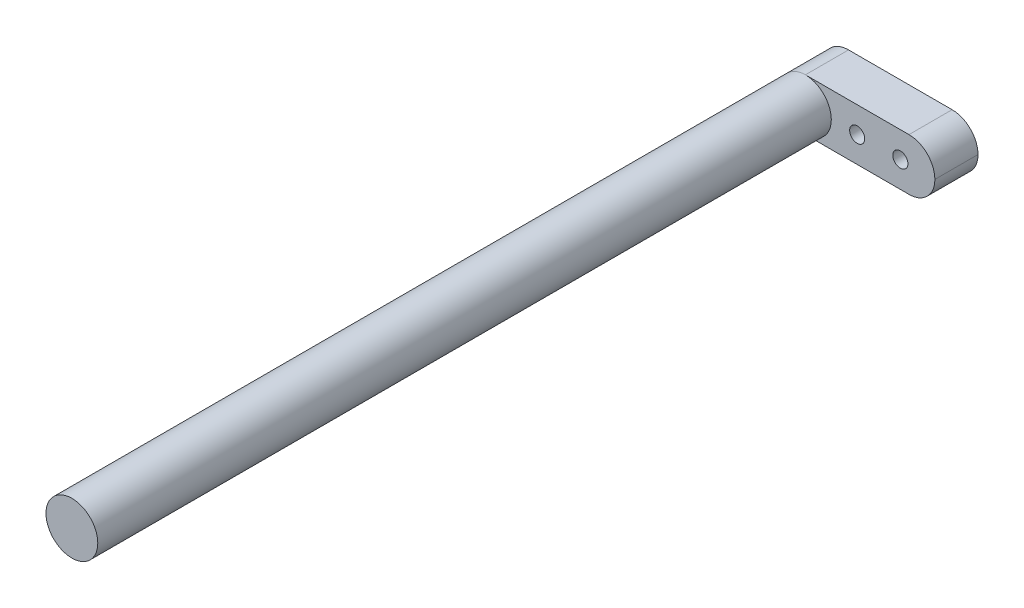
ISO-10303-21;
HEADER;
FILE_DESCRIPTION(('STEP AP214'),'2;1');
FILE_NAME('part.step','',(''),(''),'','','');
FILE_SCHEMA(('AUTOMOTIVE_DESIGN { 1 0 10303 214 1 1 1 1 }'));
ENDSEC;
DATA;
#1=APPLICATION_CONTEXT('core data for automotive mechanical design processes');
#2=APPLICATION_PROTOCOL_DEFINITION('international standard','automotive_design',2000,#1);
#3=PRODUCT_CONTEXT('',#1,'mechanical');
#4=PRODUCT('Part','Part','',(#3));
#5=PRODUCT_RELATED_PRODUCT_CATEGORY('part','',(#4));
#6=PRODUCT_DEFINITION_FORMATION('','',#4);
#7=PRODUCT_DEFINITION_CONTEXT('part definition',#1,'design');
#8=PRODUCT_DEFINITION('design','',#6,#7);
#9=PRODUCT_DEFINITION_SHAPE('','',#8);
#10=(LENGTH_UNIT() NAMED_UNIT(*) SI_UNIT(.MILLI.,.METRE.));
#11=(NAMED_UNIT(*) PLANE_ANGLE_UNIT() SI_UNIT($,.RADIAN.));
#12=(NAMED_UNIT(*) SI_UNIT($,.STERADIAN.) SOLID_ANGLE_UNIT());
#13=UNCERTAINTY_MEASURE_WITH_UNIT(LENGTH_MEASURE(1.E-05),#10,'distance_accuracy_value','');
#14=(GEOMETRIC_REPRESENTATION_CONTEXT(3) GLOBAL_UNCERTAINTY_ASSIGNED_CONTEXT((#13)) GLOBAL_UNIT_ASSIGNED_CONTEXT((#10,
#11,#12)) REPRESENTATION_CONTEXT('',''));
#15=CARTESIAN_POINT('',(0.,0.,0.));
#16=DIRECTION('',(0.,0.,1.));
#17=DIRECTION('',(1.,0.,0.));
#18=AXIS2_PLACEMENT_3D('',#15,#16,#17);
#19=CARTESIAN_POINT('',(5.,6.,10.));
#20=DIRECTION('',(0.,-1.,0.));
#21=DIRECTION('',(1.,0.,0.));
#22=AXIS2_PLACEMENT_3D('',#19,#20,#21);
#23=PLANE('',#22);
#24=DIRECTION('',(-1.,0.,0.));
#25=VECTOR('',#24,1.);
#26=CARTESIAN_POINT('',(5.,6.,10.));
#27=LINE('',#26,#25);
#28=CARTESIAN_POINT('',(-0.999999999999999,6.,10.));
#29=VERTEX_POINT('',#28);
#30=CARTESIAN_POINT('',(-25.,5.99999999999999,10.));
#31=VERTEX_POINT('',#30);
#32=EDGE_CURVE('E90',#29,#31,#27,.T.);
#33=ORIENTED_EDGE('',*,*,#32,.F.);
#34=DIRECTION('',(0.,0.,-1.));
#35=VECTOR('',#34,1.);
#36=CARTESIAN_POINT('',(-0.999999999999999,6.,10.));
#37=LINE('',#36,#35);
#38=CARTESIAN_POINT('',(-0.999999999999999,6.,0.));
#39=VERTEX_POINT('',#38);
#40=EDGE_CURVE('E11',#29,#39,#37,.T.);
#41=ORIENTED_EDGE('',*,*,#40,.T.);
#42=DIRECTION('',(-1.,0.,0.));
#43=VECTOR('',#42,1.);
#44=CARTESIAN_POINT('',(5.,6.,0.));
#45=LINE('',#44,#43);
#46=CARTESIAN_POINT('',(-25.,6.,0.));
#47=VERTEX_POINT('',#46);
#48=EDGE_CURVE('E93',#39,#47,#45,.T.);
#49=ORIENTED_EDGE('',*,*,#48,.T.);
#50=DIRECTION('',(0.,0.,-1.));
#51=VECTOR('',#50,1.);
#52=CARTESIAN_POINT('',(-25.,6.,10.));
#53=LINE('',#52,#51);
#54=EDGE_CURVE('E46',#47,#31,#53,.F.);
#55=ORIENTED_EDGE('',*,*,#54,.T.);
#56=EDGE_LOOP('',(#33,#41,#49,#55));
#57=FACE_BOUND('',#56,.T.);
#58=ADVANCED_FACE('F37',(#57),#23,.F.);
#59=CARTESIAN_POINT('',(5.,-6.,10.));
#60=DIRECTION('',(0.,1.,0.));
#61=DIRECTION('',(-1.,0.,0.));
#62=AXIS2_PLACEMENT_3D('',#59,#60,#61);
#63=PLANE('',#62);
#64=DIRECTION('',(1.,0.,0.));
#65=VECTOR('',#64,1.);
#66=CARTESIAN_POINT('',(5.,-6.,0.));
#67=LINE('',#66,#65);
#68=CARTESIAN_POINT('',(-25.,-6.,0.));
#69=VERTEX_POINT('',#68);
#70=CARTESIAN_POINT('',(-0.999999999999997,-6.,0.));
#71=VERTEX_POINT('',#70);
#72=EDGE_CURVE('E103',#69,#71,#67,.T.);
#73=ORIENTED_EDGE('',*,*,#72,.T.);
#74=DIRECTION('',(0.,0.,-1.));
#75=VECTOR('',#74,1.);
#76=CARTESIAN_POINT('',(-0.999999999999997,-6.,10.));
#77=LINE('',#76,#75);
#78=CARTESIAN_POINT('',(-0.999999999999997,-6.,10.));
#79=VERTEX_POINT('',#78);
#80=EDGE_CURVE('E137',#71,#79,#77,.F.);
#81=ORIENTED_EDGE('',*,*,#80,.T.);
#82=DIRECTION('',(1.,0.,0.));
#83=VECTOR('',#82,1.);
#84=CARTESIAN_POINT('',(5.,-6.,10.));
#85=LINE('',#84,#83);
#86=CARTESIAN_POINT('',(-25.,-6.,10.));
#87=VERTEX_POINT('',#86);
#88=EDGE_CURVE('E102',#87,#79,#85,.T.);
#89=ORIENTED_EDGE('',*,*,#88,.F.);
#90=DIRECTION('',(0.,0.,-1.));
#91=VECTOR('',#90,1.);
#92=CARTESIAN_POINT('',(-25.,-6.,10.));
#93=LINE('',#92,#91);
#94=EDGE_CURVE('E134',#87,#69,#93,.T.);
#95=ORIENTED_EDGE('',*,*,#94,.T.);
#96=EDGE_LOOP('',(#73,#81,#89,#95));
#97=FACE_BOUND('',#96,.T.);
#98=ADVANCED_FACE('F155',(#97),#63,.F.);
#99=CARTESIAN_POINT('',(0.,0.,10.));
#100=DIRECTION('',(0.,0.,-1.));
#101=DIRECTION('',(-1.,0.,0.));
#102=AXIS2_PLACEMENT_3D('',#99,#100,#101);
#103=PLANE('',#102);
#104=CARTESIAN_POINT('',(-3.,0.,10.));
#105=DIRECTION('',(0.,0.,-1.));
#106=DIRECTION('',(-1.,0.,0.));
#107=AXIS2_PLACEMENT_3D('',#104,#105,#106);
#108=CIRCLE('',#107,1.75);
#109=CARTESIAN_POINT('',(-4.75,0.,10.));
#110=VERTEX_POINT('',#109);
#111=EDGE_CURVE('E116',#110,#110,#108,.F.);
#112=ORIENTED_EDGE('',*,*,#111,.F.);
#113=EDGE_LOOP('',(#112));
#114=FACE_BOUND('',#113,.T.);
#115=CARTESIAN_POINT('',(-13.,0.,10.));
#116=DIRECTION('',(0.,0.,-1.));
#117=DIRECTION('',(-1.,0.,0.));
#118=AXIS2_PLACEMENT_3D('',#115,#116,#117);
#119=CIRCLE('',#118,1.75);
#120=CARTESIAN_POINT('',(-14.75,0.,10.));
#121=VERTEX_POINT('',#120);
#122=EDGE_CURVE('E148',#121,#121,#119,.F.);
#123=ORIENTED_EDGE('',*,*,#122,.F.);
#124=EDGE_LOOP('',(#123));
#125=FACE_BOUND('',#124,.T.);
#126=ORIENTED_EDGE('',*,*,#88,.T.);
#127=CARTESIAN_POINT('',(-0.999999999999998,0.,10.));
#128=DIRECTION('',(0.,0.,-1.));
#129=DIRECTION('',(-1.,0.,0.));
#130=AXIS2_PLACEMENT_3D('',#127,#128,#129);
#131=CIRCLE('',#130,6.);
#132=CARTESIAN_POINT('',(5.,0.,10.));
#133=VERTEX_POINT('',#132);
#134=EDGE_CURVE('E59',#79,#133,#131,.F.);
#135=ORIENTED_EDGE('',*,*,#134,.T.);
#136=CARTESIAN_POINT('',(-0.999999999999998,0.,10.));
#137=DIRECTION('',(0.,0.,-1.));
#138=DIRECTION('',(-1.,0.,0.));
#139=AXIS2_PLACEMENT_3D('',#136,#137,#138);
#140=CIRCLE('',#139,6.);
#141=EDGE_CURVE('E54',#133,#29,#140,.F.);
#142=ORIENTED_EDGE('',*,*,#141,.T.);
#143=ORIENTED_EDGE('',*,*,#32,.T.);
#144=CARTESIAN_POINT('',(-25.,0.,10.));
#145=DIRECTION('',(0.,0.,1.));
#146=DIRECTION('',(1.,0.,0.));
#147=AXIS2_PLACEMENT_3D('',#144,#145,#146);
#148=CIRCLE('',#147,5.99999999999999);
#149=EDGE_CURVE('E100',#87,#31,#148,.T.);
#150=ORIENTED_EDGE('',*,*,#149,.F.);
#151=EDGE_LOOP('',(#126,#135,#142,#143,#150));
#152=FACE_BOUND('',#151,.T.);
#153=ADVANCED_FACE('F99',(#114,#125,#152),#103,.F.);
#154=CARTESIAN_POINT('',(0.,0.,0.));
#155=DIRECTION('',(0.,0.,-1.));
#156=DIRECTION('',(-1.,0.,0.));
#157=AXIS2_PLACEMENT_3D('',#154,#155,#156);
#158=PLANE('',#157);
#159=CARTESIAN_POINT('',(-3.,0.,0.));
#160=DIRECTION('',(0.,0.,-1.));
#161=DIRECTION('',(-1.,0.,0.));
#162=AXIS2_PLACEMENT_3D('',#159,#160,#161);
#163=CIRCLE('',#162,1.75);
#164=CARTESIAN_POINT('',(-4.75,0.,0.));
#165=VERTEX_POINT('',#164);
#166=EDGE_CURVE('E120',#165,#165,#163,.T.);
#167=ORIENTED_EDGE('',*,*,#166,.F.);
#168=EDGE_LOOP('',(#167));
#169=FACE_BOUND('',#168,.T.);
#170=CARTESIAN_POINT('',(-13.,0.,0.));
#171=DIRECTION('',(0.,0.,-1.));
#172=DIRECTION('',(-1.,0.,0.));
#173=AXIS2_PLACEMENT_3D('',#170,#171,#172);
#174=CIRCLE('',#173,1.75);
#175=CARTESIAN_POINT('',(-14.75,0.,0.));
#176=VERTEX_POINT('',#175);
#177=EDGE_CURVE('E143',#176,#176,#174,.T.);
#178=ORIENTED_EDGE('',*,*,#177,.F.);
#179=EDGE_LOOP('',(#178));
#180=FACE_BOUND('',#179,.T.);
#181=CARTESIAN_POINT('',(-0.999999999999998,0.,0.));
#182=DIRECTION('',(0.,0.,-1.));
#183=DIRECTION('',(-1.,0.,0.));
#184=AXIS2_PLACEMENT_3D('',#181,#182,#183);
#185=CIRCLE('',#184,6.);
#186=CARTESIAN_POINT('',(5.,0.,0.));
#187=VERTEX_POINT('',#186);
#188=EDGE_CURVE('E126',#39,#187,#185,.T.);
#189=ORIENTED_EDGE('',*,*,#188,.T.);
#190=CARTESIAN_POINT('',(-0.999999999999998,0.,0.));
#191=DIRECTION('',(0.,0.,-1.));
#192=DIRECTION('',(-1.,0.,0.));
#193=AXIS2_PLACEMENT_3D('',#190,#191,#192);
#194=CIRCLE('',#193,6.);
#195=EDGE_CURVE('E132',#187,#71,#194,.T.);
#196=ORIENTED_EDGE('',*,*,#195,.T.);
#197=ORIENTED_EDGE('',*,*,#72,.F.);
#198=CARTESIAN_POINT('',(-25.,0.,0.));
#199=DIRECTION('',(0.,0.,-1.));
#200=DIRECTION('',(-1.,0.,0.));
#201=AXIS2_PLACEMENT_3D('',#198,#199,#200);
#202=CIRCLE('',#201,6.);
#203=CARTESIAN_POINT('',(-31.,0.,0.));
#204=VERTEX_POINT('',#203);
#205=EDGE_CURVE('E123',#69,#204,#202,.T.);
#206=ORIENTED_EDGE('',*,*,#205,.T.);
#207=CARTESIAN_POINT('',(-25.,0.,0.));
#208=DIRECTION('',(0.,0.,-1.));
#209=DIRECTION('',(-1.,0.,0.));
#210=AXIS2_PLACEMENT_3D('',#207,#208,#209);
#211=CIRCLE('',#210,6.);
#212=EDGE_CURVE('E122',#204,#47,#211,.T.);
#213=ORIENTED_EDGE('',*,*,#212,.T.);
#214=ORIENTED_EDGE('',*,*,#48,.F.);
#215=EDGE_LOOP('',(#189,#196,#197,#206,#213,#214));
#216=FACE_BOUND('',#215,.T.);
#217=ADVANCED_FACE('F157',(#169,#180,#216),#158,.T.);
#218=CARTESIAN_POINT('',(-25.,0.,180.));
#219=DIRECTION('',(0.,0.,-1.));
#220=DIRECTION('',(-1.,0.,0.));
#221=AXIS2_PLACEMENT_3D('',#218,#219,#220);
#222=CYLINDRICAL_SURFACE('',#221,5.99999999999999);
#223=CARTESIAN_POINT('',(-25.,0.,180.));
#224=DIRECTION('',(0.,0.,1.));
#225=DIRECTION('',(1.,0.,0.));
#226=AXIS2_PLACEMENT_3D('',#223,#224,#225);
#227=CIRCLE('',#226,5.99999999999999);
#228=CARTESIAN_POINT('',(-19.,0.,180.));
#229=VERTEX_POINT('',#228);
#230=EDGE_CURVE('E115',#229,#229,#227,.T.);
#231=ORIENTED_EDGE('',*,*,#230,.F.);
#232=EDGE_LOOP('',(#231));
#233=FACE_BOUND('',#232,.T.);
#234=CARTESIAN_POINT('',(-31.,0.,10.));
#235=VERTEX_POINT('',#234);
#236=EDGE_CURVE('E108',#31,#235,#148,.T.);
#237=ORIENTED_EDGE('',*,*,#236,.T.);
#238=EDGE_CURVE('E111',#235,#87,#148,.T.);
#239=ORIENTED_EDGE('',*,*,#238,.T.);
#240=ORIENTED_EDGE('',*,*,#149,.T.);
#241=EDGE_LOOP('',(#237,#239,#240));
#242=FACE_BOUND('',#241,.T.);
#243=ADVANCED_FACE('F107',(#233,#242),#222,.T.);
#244=CARTESIAN_POINT('',(-25.,0.,180.));
#245=DIRECTION('',(0.,0.,1.));
#246=DIRECTION('',(1.,0.,0.));
#247=AXIS2_PLACEMENT_3D('',#244,#245,#246);
#248=PLANE('',#247);
#249=ORIENTED_EDGE('',*,*,#230,.T.);
#250=EDGE_LOOP('',(#249));
#251=FACE_BOUND('',#250,.T.);
#252=ADVANCED_FACE('F186',(#251),#248,.T.);
#253=CARTESIAN_POINT('',(-13.,0.,180.001));
#254=DIRECTION('',(0.,0.,-1.));
#255=DIRECTION('',(-1.,0.,0.));
#256=AXIS2_PLACEMENT_3D('',#253,#254,#255);
#257=CYLINDRICAL_SURFACE('',#256,1.75);
#258=ORIENTED_EDGE('',*,*,#177,.T.);
#259=EDGE_LOOP('',(#258));
#260=FACE_BOUND('',#259,.T.);
#261=ORIENTED_EDGE('',*,*,#122,.T.);
#262=EDGE_LOOP('',(#261));
#263=FACE_BOUND('',#262,.T.);
#264=ADVANCED_FACE('F190',(#260,#263),#257,.F.);
#265=CARTESIAN_POINT('',(-3.,0.,180.001));
#266=DIRECTION('',(0.,0.,-1.));
#267=DIRECTION('',(-1.,0.,0.));
#268=AXIS2_PLACEMENT_3D('',#265,#266,#267);
#269=CYLINDRICAL_SURFACE('',#268,1.75);
#270=ORIENTED_EDGE('',*,*,#166,.T.);
#271=EDGE_LOOP('',(#270));
#272=FACE_BOUND('',#271,.T.);
#273=ORIENTED_EDGE('',*,*,#111,.T.);
#274=EDGE_LOOP('',(#273));
#275=FACE_BOUND('',#274,.T.);
#276=ADVANCED_FACE('F168',(#272,#275),#269,.F.);
#277=CARTESIAN_POINT('',(-0.999999999999998,0.,10.));
#278=DIRECTION('',(0.,0.,-1.));
#279=DIRECTION('',(-1.,0.,0.));
#280=AXIS2_PLACEMENT_3D('',#277,#278,#279);
#281=CYLINDRICAL_SURFACE('',#280,6.);
#282=ORIENTED_EDGE('',*,*,#40,.F.);
#283=ORIENTED_EDGE('',*,*,#141,.F.);
#284=DIRECTION('',(0.,0.,-1.));
#285=VECTOR('',#284,1.);
#286=CARTESIAN_POINT('',(5.,0.,10.));
#287=LINE('',#286,#285);
#288=EDGE_CURVE('E141',#187,#133,#287,.F.);
#289=ORIENTED_EDGE('',*,*,#288,.F.);
#290=ORIENTED_EDGE('',*,*,#188,.F.);
#291=EDGE_LOOP('',(#282,#283,#289,#290));
#292=FACE_BOUND('',#291,.T.);
#293=ADVANCED_FACE('F162',(#292),#281,.T.);
#294=CARTESIAN_POINT('',(-0.999999999999998,0.,10.));
#295=DIRECTION('',(0.,0.,-1.));
#296=DIRECTION('',(-1.,0.,0.));
#297=AXIS2_PLACEMENT_3D('',#294,#295,#296);
#298=CYLINDRICAL_SURFACE('',#297,6.);
#299=ORIENTED_EDGE('',*,*,#134,.F.);
#300=ORIENTED_EDGE('',*,*,#80,.F.);
#301=ORIENTED_EDGE('',*,*,#195,.F.);
#302=ORIENTED_EDGE('',*,*,#288,.T.);
#303=EDGE_LOOP('',(#299,#300,#301,#302));
#304=FACE_BOUND('',#303,.T.);
#305=ADVANCED_FACE('F160',(#304),#298,.T.);
#306=CARTESIAN_POINT('',(-25.,0.,10.));
#307=DIRECTION('',(0.,0.,-1.));
#308=DIRECTION('',(-1.,0.,0.));
#309=AXIS2_PLACEMENT_3D('',#306,#307,#308);
#310=CYLINDRICAL_SURFACE('',#309,6.);
#311=DIRECTION('',(0.,0.,-1.));
#312=VECTOR('',#311,1.);
#313=CARTESIAN_POINT('',(-31.,0.,10.));
#314=LINE('',#313,#312);
#315=EDGE_CURVE('E41',#235,#204,#314,.T.);
#316=ORIENTED_EDGE('',*,*,#315,.F.);
#317=ORIENTED_EDGE('',*,*,#236,.F.);
#318=ORIENTED_EDGE('',*,*,#54,.F.);
#319=ORIENTED_EDGE('',*,*,#212,.F.);
#320=EDGE_LOOP('',(#316,#317,#318,#319));
#321=FACE_BOUND('',#320,.T.);
#322=ADVANCED_FACE('F39',(#321),#310,.T.);
#323=CARTESIAN_POINT('',(-25.,0.,10.));
#324=DIRECTION('',(0.,0.,-1.));
#325=DIRECTION('',(-1.,0.,0.));
#326=AXIS2_PLACEMENT_3D('',#323,#324,#325);
#327=CYLINDRICAL_SURFACE('',#326,6.);
#328=ORIENTED_EDGE('',*,*,#238,.F.);
#329=ORIENTED_EDGE('',*,*,#315,.T.);
#330=ORIENTED_EDGE('',*,*,#205,.F.);
#331=ORIENTED_EDGE('',*,*,#94,.F.);
#332=EDGE_LOOP('',(#328,#329,#330,#331));
#333=FACE_BOUND('',#332,.T.);
#334=ADVANCED_FACE('F151',(#333),#327,.T.);
#335=CLOSED_SHELL('',(#58,#98,#153,#217,#243,#252,#264,#276,#293,#305,#322,#334));
#336=MANIFOLD_SOLID_BREP('B2',#335);
#337=ADVANCED_BREP_SHAPE_REPRESENTATION('',(#18,#336),#14);
#338=SHAPE_DEFINITION_REPRESENTATION(#9,#337);
ENDSEC;
END-ISO-10303-21;
